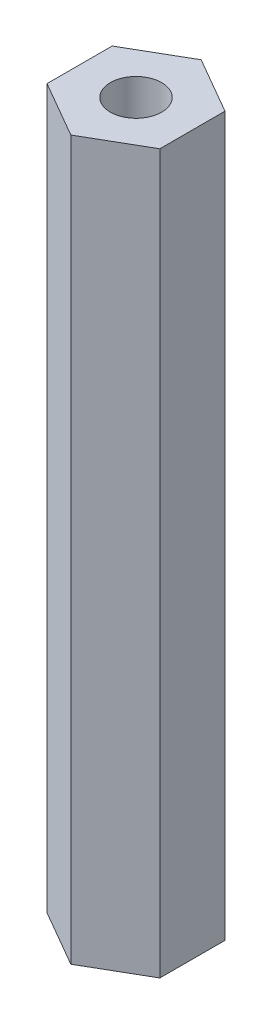
ISO-10303-21;
HEADER;
FILE_DESCRIPTION(('STEP AP214'),'2;1');
FILE_NAME('part.step','',(''),(''),'','','');
FILE_SCHEMA(('AUTOMOTIVE_DESIGN { 1 0 10303 214 1 1 1 1 }'));
ENDSEC;
DATA;
#1=APPLICATION_CONTEXT('core data for automotive mechanical design processes');
#2=APPLICATION_PROTOCOL_DEFINITION('international standard','automotive_design',2000,#1);
#3=PRODUCT_CONTEXT('',#1,'mechanical');
#4=PRODUCT('Part','Part','',(#3));
#5=PRODUCT_RELATED_PRODUCT_CATEGORY('part','',(#4));
#6=PRODUCT_DEFINITION_FORMATION('','',#4);
#7=PRODUCT_DEFINITION_CONTEXT('part definition',#1,'design');
#8=PRODUCT_DEFINITION('design','',#6,#7);
#9=PRODUCT_DEFINITION_SHAPE('','',#8);
#10=(LENGTH_UNIT() NAMED_UNIT(*) SI_UNIT(.MILLI.,.METRE.));
#11=(NAMED_UNIT(*) PLANE_ANGLE_UNIT() SI_UNIT($,.RADIAN.));
#12=(NAMED_UNIT(*) SI_UNIT($,.STERADIAN.) SOLID_ANGLE_UNIT());
#13=UNCERTAINTY_MEASURE_WITH_UNIT(LENGTH_MEASURE(1.E-05),#10,'distance_accuracy_value','');
#14=(GEOMETRIC_REPRESENTATION_CONTEXT(3) GLOBAL_UNCERTAINTY_ASSIGNED_CONTEXT((#13)) GLOBAL_UNIT_ASSIGNED_CONTEXT((#10,
#11,#12)) REPRESENTATION_CONTEXT('',''));
#15=CARTESIAN_POINT('',(0.,0.,0.));
#16=DIRECTION('',(0.,0.,1.));
#17=DIRECTION('',(1.,0.,0.));
#18=AXIS2_PLACEMENT_3D('',#15,#16,#17);
#19=CARTESIAN_POINT('',(2.74999999999998,35.,-1.5877132402715));
#20=DIRECTION('',(-0.499999999999995,0.,0.866025403784442));
#21=DIRECTION('',(0.866025403784442,0.,0.499999999999995));
#22=AXIS2_PLACEMENT_3D('',#19,#20,#21);
#23=PLANE('',#22);
#24=DIRECTION('',(-0.866025403784442,0.,-0.499999999999995));
#25=VECTOR('',#24,1.);
#26=CARTESIAN_POINT('',(2.74999999999998,0.,-1.5877132402715));
#27=LINE('',#26,#25);
#28=CARTESIAN_POINT('',(2.74999999999998,0.,-1.5877132402715));
#29=VERTEX_POINT('',#28);
#30=CARTESIAN_POINT('',(0.,0.,-3.17542648054294));
#31=VERTEX_POINT('',#30);
#32=EDGE_CURVE('E120',#29,#31,#27,.T.);
#33=ORIENTED_EDGE('',*,*,#32,.T.);
#34=DIRECTION('',(0.,-1.,0.));
#35=VECTOR('',#34,1.);
#36=CARTESIAN_POINT('',(0.,35.,-3.17542648054294));
#37=LINE('',#36,#35);
#38=CARTESIAN_POINT('',(0.,35.,-3.17542648054294));
#39=VERTEX_POINT('',#38);
#40=EDGE_CURVE('E11',#39,#31,#37,.T.);
#41=ORIENTED_EDGE('',*,*,#40,.F.);
#42=DIRECTION('',(-0.866025403784442,0.,-0.499999999999995));
#43=VECTOR('',#42,1.);
#44=CARTESIAN_POINT('',(2.74999999999998,35.,-1.5877132402715));
#45=LINE('',#44,#43);
#46=CARTESIAN_POINT('',(2.74999999999998,35.,-1.5877132402715));
#47=VERTEX_POINT('',#46);
#48=EDGE_CURVE('E131',#47,#39,#45,.T.);
#49=ORIENTED_EDGE('',*,*,#48,.F.);
#50=DIRECTION('',(0.,-1.,0.));
#51=VECTOR('',#50,1.);
#52=CARTESIAN_POINT('',(2.74999999999998,35.,-1.5877132402715));
#53=LINE('',#52,#51);
#54=EDGE_CURVE('E116',#47,#29,#53,.T.);
#55=ORIENTED_EDGE('',*,*,#54,.T.);
#56=EDGE_LOOP('',(#33,#41,#49,#55));
#57=FACE_BOUND('',#56,.T.);
#58=ADVANCED_FACE('F33',(#57),#23,.F.);
#59=CARTESIAN_POINT('',(0.,35.,-3.17542648054294));
#60=DIRECTION('',(0.500000000000001,0.,0.866025403784438));
#61=DIRECTION('',(0.866025403784438,0.,-0.500000000000001));
#62=AXIS2_PLACEMENT_3D('',#59,#60,#61);
#63=PLANE('',#62);
#64=DIRECTION('',(-0.866025403784438,0.,0.500000000000001));
#65=VECTOR('',#64,1.);
#66=CARTESIAN_POINT('',(0.,0.,-3.17542648054294));
#67=LINE('',#66,#65);
#68=CARTESIAN_POINT('',(-2.75000000000001,0.,-1.58771324027147));
#69=VERTEX_POINT('',#68);
#70=EDGE_CURVE('E123',#31,#69,#67,.T.);
#71=ORIENTED_EDGE('',*,*,#70,.T.);
#72=DIRECTION('',(0.,-1.,0.));
#73=VECTOR('',#72,1.);
#74=CARTESIAN_POINT('',(-2.75000000000001,35.,-1.58771324027147));
#75=LINE('',#74,#73);
#76=CARTESIAN_POINT('',(-2.75000000000001,35.,-1.58771324027147));
#77=VERTEX_POINT('',#76);
#78=EDGE_CURVE('E41',#77,#69,#75,.T.);
#79=ORIENTED_EDGE('',*,*,#78,.F.);
#80=DIRECTION('',(-0.866025403784438,0.,0.500000000000001));
#81=VECTOR('',#80,1.);
#82=CARTESIAN_POINT('',(0.,35.,-3.17542648054294));
#83=LINE('',#82,#81);
#84=EDGE_CURVE('E87',#39,#77,#83,.T.);
#85=ORIENTED_EDGE('',*,*,#84,.F.);
#86=ORIENTED_EDGE('',*,*,#40,.T.);
#87=EDGE_LOOP('',(#71,#79,#85,#86));
#88=FACE_BOUND('',#87,.T.);
#89=ADVANCED_FACE('F156',(#88),#63,.F.);
#90=CARTESIAN_POINT('',(-2.75000000000001,35.,-1.58771324027147));
#91=DIRECTION('',(1.,0.,0.));
#92=DIRECTION('',(0.,0.,-1.));
#93=AXIS2_PLACEMENT_3D('',#90,#91,#92);
#94=PLANE('',#93);
#95=DIRECTION('',(0.,0.,1.));
#96=VECTOR('',#95,1.);
#97=CARTESIAN_POINT('',(-2.75000000000001,0.,-1.58771324027147));
#98=LINE('',#97,#96);
#99=CARTESIAN_POINT('',(-2.74999999999999,0.,1.58771324027148));
#100=VERTEX_POINT('',#99);
#101=EDGE_CURVE('E126',#69,#100,#98,.T.);
#102=ORIENTED_EDGE('',*,*,#101,.T.);
#103=DIRECTION('',(0.,-1.,0.));
#104=VECTOR('',#103,1.);
#105=CARTESIAN_POINT('',(-2.74999999999999,35.,1.58771324027148));
#106=LINE('',#105,#104);
#107=CARTESIAN_POINT('',(-2.74999999999999,35.,1.58771324027148));
#108=VERTEX_POINT('',#107);
#109=EDGE_CURVE('E111',#108,#100,#106,.T.);
#110=ORIENTED_EDGE('',*,*,#109,.F.);
#111=DIRECTION('',(0.,0.,1.));
#112=VECTOR('',#111,1.);
#113=CARTESIAN_POINT('',(-2.75000000000001,35.,-1.58771324027147));
#114=LINE('',#113,#112);
#115=EDGE_CURVE('E102',#77,#108,#114,.T.);
#116=ORIENTED_EDGE('',*,*,#115,.F.);
#117=ORIENTED_EDGE('',*,*,#78,.T.);
#118=EDGE_LOOP('',(#102,#110,#116,#117));
#119=FACE_BOUND('',#118,.T.);
#120=ADVANCED_FACE('F137',(#119),#94,.F.);
#121=CARTESIAN_POINT('',(-2.74999999999999,35.,1.58771324027148));
#122=DIRECTION('',(0.499999999999995,0.,-0.866025403784441));
#123=DIRECTION('',(-0.866025403784441,0.,-0.499999999999995));
#124=AXIS2_PLACEMENT_3D('',#121,#122,#123);
#125=PLANE('',#124);
#126=DIRECTION('',(0.866025403784441,0.,0.499999999999995));
#127=VECTOR('',#126,1.);
#128=CARTESIAN_POINT('',(-2.74999999999999,0.,1.58771324027148));
#129=LINE('',#128,#127);
#130=CARTESIAN_POINT('',(0.,0.,3.17542648054294));
#131=VERTEX_POINT('',#130);
#132=EDGE_CURVE('E110',#100,#131,#129,.T.);
#133=ORIENTED_EDGE('',*,*,#132,.T.);
#134=DIRECTION('',(0.,-1.,0.));
#135=VECTOR('',#134,1.);
#136=CARTESIAN_POINT('',(0.,35.,3.17542648054294));
#137=LINE('',#136,#135);
#138=CARTESIAN_POINT('',(0.,35.,3.17542648054294));
#139=VERTEX_POINT('',#138);
#140=EDGE_CURVE('E107',#139,#131,#137,.T.);
#141=ORIENTED_EDGE('',*,*,#140,.F.);
#142=DIRECTION('',(0.866025403784441,0.,0.499999999999995));
#143=VECTOR('',#142,1.);
#144=CARTESIAN_POINT('',(-2.74999999999999,35.,1.58771324027148));
#145=LINE('',#144,#143);
#146=EDGE_CURVE('E96',#108,#139,#145,.T.);
#147=ORIENTED_EDGE('',*,*,#146,.F.);
#148=ORIENTED_EDGE('',*,*,#109,.T.);
#149=EDGE_LOOP('',(#133,#141,#147,#148));
#150=FACE_BOUND('',#149,.T.);
#151=ADVANCED_FACE('F108',(#150),#125,.F.);
#152=CARTESIAN_POINT('',(0.,35.,3.17542648054294));
#153=DIRECTION('',(-0.500000000000007,0.,-0.866025403784435));
#154=DIRECTION('',(-0.866025403784435,0.,0.500000000000007));
#155=AXIS2_PLACEMENT_3D('',#152,#153,#154);
#156=PLANE('',#155);
#157=DIRECTION('',(0.866025403784435,0.,-0.500000000000007));
#158=VECTOR('',#157,1.);
#159=CARTESIAN_POINT('',(0.,0.,3.17542648054294));
#160=LINE('',#159,#158);
#161=CARTESIAN_POINT('',(2.75000000000002,0.,1.58771324027145));
#162=VERTEX_POINT('',#161);
#163=EDGE_CURVE('E73',#131,#162,#160,.T.);
#164=ORIENTED_EDGE('',*,*,#163,.T.);
#165=DIRECTION('',(0.,-1.,0.));
#166=VECTOR('',#165,1.);
#167=CARTESIAN_POINT('',(2.75000000000002,35.,1.58771324027145));
#168=LINE('',#167,#166);
#169=CARTESIAN_POINT('',(2.75000000000002,35.,1.58771324027145));
#170=VERTEX_POINT('',#169);
#171=EDGE_CURVE('E112',#170,#162,#168,.T.);
#172=ORIENTED_EDGE('',*,*,#171,.F.);
#173=DIRECTION('',(0.866025403784435,0.,-0.500000000000007));
#174=VECTOR('',#173,1.);
#175=CARTESIAN_POINT('',(0.,35.,3.17542648054294));
#176=LINE('',#175,#174);
#177=EDGE_CURVE('E100',#139,#170,#176,.T.);
#178=ORIENTED_EDGE('',*,*,#177,.F.);
#179=ORIENTED_EDGE('',*,*,#140,.T.);
#180=EDGE_LOOP('',(#164,#172,#178,#179));
#181=FACE_BOUND('',#180,.T.);
#182=ADVANCED_FACE('F114',(#181),#156,.F.);
#183=CARTESIAN_POINT('',(2.75000000000002,35.,1.58771324027145));
#184=DIRECTION('',(-1.,0.,0.));
#185=DIRECTION('',(0.,0.,1.));
#186=AXIS2_PLACEMENT_3D('',#183,#184,#185);
#187=PLANE('',#186);
#188=DIRECTION('',(0.,0.,-1.));
#189=VECTOR('',#188,1.);
#190=CARTESIAN_POINT('',(2.75000000000002,0.,1.58771324027145));
#191=LINE('',#190,#189);
#192=EDGE_CURVE('E79',#162,#29,#191,.T.);
#193=ORIENTED_EDGE('',*,*,#192,.T.);
#194=ORIENTED_EDGE('',*,*,#54,.F.);
#195=DIRECTION('',(0.,0.,-1.));
#196=VECTOR('',#195,1.);
#197=CARTESIAN_POINT('',(2.75000000000002,35.,1.58771324027145));
#198=LINE('',#197,#196);
#199=EDGE_CURVE('E49',#170,#47,#198,.T.);
#200=ORIENTED_EDGE('',*,*,#199,.F.);
#201=ORIENTED_EDGE('',*,*,#171,.T.);
#202=EDGE_LOOP('',(#193,#194,#200,#201));
#203=FACE_BOUND('',#202,.T.);
#204=ADVANCED_FACE('F144',(#203),#187,.F.);
#205=CARTESIAN_POINT('',(0.,35.,0.));
#206=DIRECTION('',(0.,1.,0.));
#207=DIRECTION('',(0.,0.,1.));
#208=AXIS2_PLACEMENT_3D('',#205,#206,#207);
#209=PLANE('',#208);
#210=CARTESIAN_POINT('',(0.,35.,0.));
#211=DIRECTION('',(0.,1.,0.));
#212=DIRECTION('',(0.,0.,1.));
#213=AXIS2_PLACEMENT_3D('',#210,#211,#212);
#214=CIRCLE('',#213,1.24999999999999);
#215=CARTESIAN_POINT('',(0.,35.,1.24999999999999));
#216=VERTEX_POINT('',#215);
#217=EDGE_CURVE('E244',#216,#216,#214,.T.);
#218=ORIENTED_EDGE('',*,*,#217,.F.);
#219=EDGE_LOOP('',(#218));
#220=FACE_BOUND('',#219,.T.);
#221=ORIENTED_EDGE('',*,*,#48,.T.);
#222=ORIENTED_EDGE('',*,*,#84,.T.);
#223=ORIENTED_EDGE('',*,*,#115,.T.);
#224=ORIENTED_EDGE('',*,*,#146,.T.);
#225=ORIENTED_EDGE('',*,*,#177,.T.);
#226=ORIENTED_EDGE('',*,*,#199,.T.);
#227=EDGE_LOOP('',(#221,#222,#223,#224,#225,#226));
#228=FACE_BOUND('',#227,.T.);
#229=ADVANCED_FACE('F98',(#220,#228),#209,.T.);
#230=CARTESIAN_POINT('',(0.,0.,0.));
#231=DIRECTION('',(0.,1.,0.));
#232=DIRECTION('',(0.,0.,1.));
#233=AXIS2_PLACEMENT_3D('',#230,#231,#232);
#234=PLANE('',#233);
#235=CARTESIAN_POINT('',(0.,0.,0.));
#236=DIRECTION('',(0.,-1.,0.));
#237=DIRECTION('',(0.,0.,-1.));
#238=AXIS2_PLACEMENT_3D('',#235,#236,#237);
#239=CIRCLE('',#238,1.24999999999999);
#240=CARTESIAN_POINT('',(0.,0.,-1.24999999999999));
#241=VERTEX_POINT('',#240);
#242=EDGE_CURVE('E242',#241,#241,#239,.T.);
#243=ORIENTED_EDGE('',*,*,#242,.F.);
#244=EDGE_LOOP('',(#243));
#245=FACE_BOUND('',#244,.T.);
#246=ORIENTED_EDGE('',*,*,#32,.F.);
#247=ORIENTED_EDGE('',*,*,#192,.F.);
#248=ORIENTED_EDGE('',*,*,#163,.F.);
#249=ORIENTED_EDGE('',*,*,#132,.F.);
#250=ORIENTED_EDGE('',*,*,#101,.F.);
#251=ORIENTED_EDGE('',*,*,#70,.F.);
#252=EDGE_LOOP('',(#246,#247,#248,#249,#250,#251));
#253=FACE_BOUND('',#252,.T.);
#254=ADVANCED_FACE('F140',(#245,#253),#234,.F.);
#255=CARTESIAN_POINT('',(0.,25.,0.));
#256=DIRECTION('',(0.,1.,0.));
#257=DIRECTION('',(0.,0.,1.));
#258=AXIS2_PLACEMENT_3D('',#255,#256,#257);
#259=CONICAL_SURFACE('',#258,1.25,1.02974425867665);
#260=CARTESIAN_POINT('',(0.,24.2489242262155,0.));
#261=VERTEX_POINT('',#260);
#262=VERTEX_LOOP('',#261);
#263=FACE_BOUND('',#262,.T.);
#264=CARTESIAN_POINT('',(0.,25.,0.));
#265=DIRECTION('',(0.,1.,0.));
#266=DIRECTION('',(0.,0.,1.));
#267=AXIS2_PLACEMENT_3D('',#264,#265,#266);
#268=CIRCLE('',#267,1.25);
#269=CARTESIAN_POINT('',(0.,25.,1.25));
#270=VERTEX_POINT('',#269);
#271=EDGE_CURVE('E124',#270,#270,#268,.T.);
#272=ORIENTED_EDGE('',*,*,#271,.T.);
#273=EDGE_LOOP('',(#272));
#274=FACE_BOUND('',#273,.T.);
#275=ADVANCED_FACE('F191',(#263,#274),#259,.F.);
#276=CARTESIAN_POINT('',(0.,35.,0.));
#277=DIRECTION('',(0.,1.,0.));
#278=DIRECTION('',(0.,0.,1.));
#279=AXIS2_PLACEMENT_3D('',#276,#277,#278);
#280=CYLINDRICAL_SURFACE('',#279,1.24999999999999);
#281=ORIENTED_EDGE('',*,*,#271,.F.);
#282=EDGE_LOOP('',(#281));
#283=FACE_BOUND('',#282,.T.);
#284=ORIENTED_EDGE('',*,*,#217,.T.);
#285=EDGE_LOOP('',(#284));
#286=FACE_BOUND('',#285,.T.);
#287=ADVANCED_FACE('F196',(#283,#286),#280,.F.);
#288=CARTESIAN_POINT('',(0.,9.99999999999999,0.));
#289=DIRECTION('',(0.,-1.,0.));
#290=DIRECTION('',(0.,0.,-1.));
#291=AXIS2_PLACEMENT_3D('',#288,#289,#290);
#292=CONICAL_SURFACE('',#291,1.24999999999999,1.02974425867665);
#293=CARTESIAN_POINT('',(0.,10.7510757737845,0.));
#294=VERTEX_POINT('',#293);
#295=VERTEX_LOOP('',#294);
#296=FACE_BOUND('',#295,.T.);
#297=CARTESIAN_POINT('',(0.,9.99999999999999,0.));
#298=DIRECTION('',(0.,-1.,0.));
#299=DIRECTION('',(0.,0.,-1.));
#300=AXIS2_PLACEMENT_3D('',#297,#298,#299);
#301=CIRCLE('',#300,1.24999999999999);
#302=CARTESIAN_POINT('',(0.,9.99999999999999,-1.24999999999999));
#303=VERTEX_POINT('',#302);
#304=EDGE_CURVE('E239',#303,#303,#301,.T.);
#305=ORIENTED_EDGE('',*,*,#304,.T.);
#306=EDGE_LOOP('',(#305));
#307=FACE_BOUND('',#306,.T.);
#308=ADVANCED_FACE('F206',(#296,#307),#292,.F.);
#309=CARTESIAN_POINT('',(0.,0.,0.));
#310=DIRECTION('',(0.,-1.,0.));
#311=DIRECTION('',(0.,0.,-1.));
#312=AXIS2_PLACEMENT_3D('',#309,#310,#311);
#313=CYLINDRICAL_SURFACE('',#312,1.24999999999999);
#314=ORIENTED_EDGE('',*,*,#304,.F.);
#315=EDGE_LOOP('',(#314));
#316=FACE_BOUND('',#315,.T.);
#317=ORIENTED_EDGE('',*,*,#242,.T.);
#318=EDGE_LOOP('',(#317));
#319=FACE_BOUND('',#318,.T.);
#320=ADVANCED_FACE('F222',(#316,#319),#313,.F.);
#321=CLOSED_SHELL('',(#58,#89,#120,#151,#182,#204,#229,#254,#275,#287,#308,#320));
#322=MANIFOLD_SOLID_BREP('B2',#321);
#323=ADVANCED_BREP_SHAPE_REPRESENTATION('',(#18,#322),#14);
#324=SHAPE_DEFINITION_REPRESENTATION(#9,#323);
ENDSEC;
END-ISO-10303-21;
